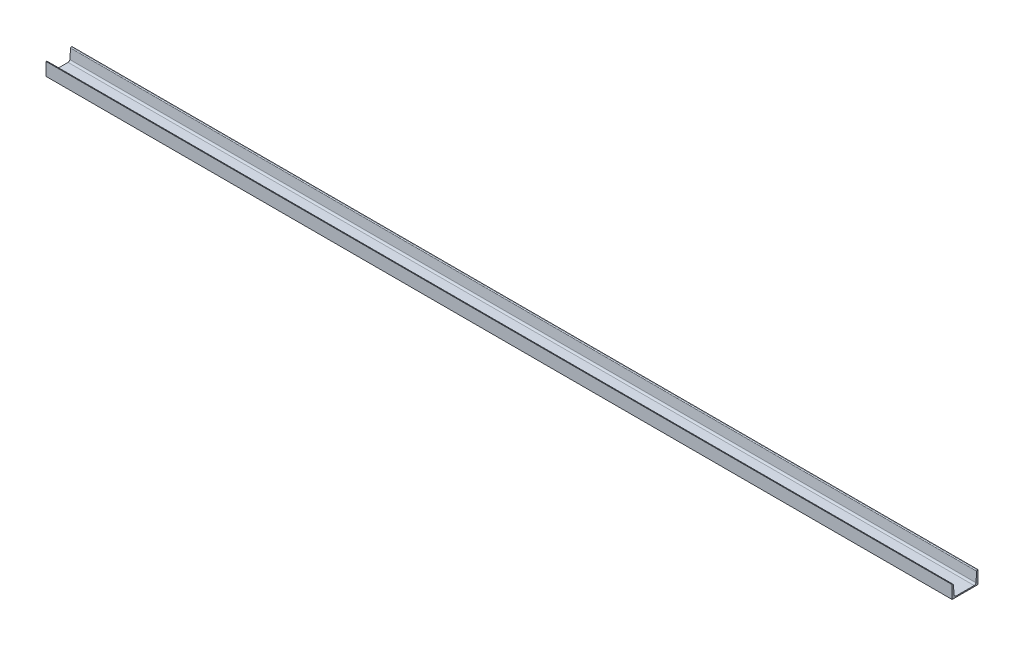
ISO-10303-21;
HEADER;
FILE_DESCRIPTION(('STEP AP214'),'2;1');
FILE_NAME('part.step','',(''),(''),'','','');
FILE_SCHEMA(('AUTOMOTIVE_DESIGN { 1 0 10303 214 1 1 1 1 }'));
ENDSEC;
DATA;
#1=APPLICATION_CONTEXT('core data for automotive mechanical design processes');
#2=APPLICATION_PROTOCOL_DEFINITION('international standard','automotive_design',2000,#1);
#3=PRODUCT_CONTEXT('',#1,'mechanical');
#4=PRODUCT('Part','Part','',(#3));
#5=PRODUCT_RELATED_PRODUCT_CATEGORY('part','',(#4));
#6=PRODUCT_DEFINITION_FORMATION('','',#4);
#7=PRODUCT_DEFINITION_CONTEXT('part definition',#1,'design');
#8=PRODUCT_DEFINITION('design','',#6,#7);
#9=PRODUCT_DEFINITION_SHAPE('','',#8);
#10=(LENGTH_UNIT() NAMED_UNIT(*) SI_UNIT(.MILLI.,.METRE.));
#11=(NAMED_UNIT(*) PLANE_ANGLE_UNIT() SI_UNIT($,.RADIAN.));
#12=(NAMED_UNIT(*) SI_UNIT($,.STERADIAN.) SOLID_ANGLE_UNIT());
#13=UNCERTAINTY_MEASURE_WITH_UNIT(LENGTH_MEASURE(1.E-05),#10,'distance_accuracy_value','');
#14=(GEOMETRIC_REPRESENTATION_CONTEXT(3) GLOBAL_UNCERTAINTY_ASSIGNED_CONTEXT((#13)) GLOBAL_UNIT_ASSIGNED_CONTEXT((#10,
#11,#12)) REPRESENTATION_CONTEXT('',''));
#15=CARTESIAN_POINT('',(0.,0.,0.));
#16=DIRECTION('',(0.,0.,1.));
#17=DIRECTION('',(1.,0.,0.));
#18=AXIS2_PLACEMENT_3D('',#15,#16,#17);
#19=CARTESIAN_POINT('',(5250.,70.,147.57814259585));
#20=DIRECTION('',(-1.,0.,0.));
#21=DIRECTION('',(0.,0.,1.));
#22=AXIS2_PLACEMENT_3D('',#19,#20,#21);
#23=CYLINDRICAL_SURFACE('',#22,5.00000000000001);
#24=CARTESIAN_POINT('',(0.,70.,147.57814259585));
#25=DIRECTION('',(1.,0.,0.));
#26=DIRECTION('',(0.,0.,-1.));
#27=AXIS2_PLACEMENT_3D('',#24,#25,#26);
#28=CIRCLE('',#27,5.00000000000001);
#29=CARTESIAN_POINT('',(0.,70.4357787137382,142.597169105391));
#30=VERTEX_POINT('',#29);
#31=CARTESIAN_POINT('',(0.,75.,147.57814259585));
#32=VERTEX_POINT('',#31);
#33=EDGE_CURVE('E198',#30,#32,#28,.T.);
#34=ORIENTED_EDGE('',*,*,#33,.T.);
#35=DIRECTION('',(-1.,0.,0.));
#36=VECTOR('',#35,1.);
#37=CARTESIAN_POINT('',(5250.,75.,147.57814259585));
#38=LINE('',#37,#36);
#39=CARTESIAN_POINT('',(5250.,75.,147.57814259585));
#40=VERTEX_POINT('',#39);
#41=EDGE_CURVE('E13',#40,#32,#38,.T.);
#42=ORIENTED_EDGE('',*,*,#41,.F.);
#43=CARTESIAN_POINT('',(5250.,70.,147.57814259585));
#44=DIRECTION('',(1.,0.,0.));
#45=DIRECTION('',(0.,0.,-1.));
#46=AXIS2_PLACEMENT_3D('',#43,#44,#45);
#47=CIRCLE('',#46,5.00000000000001);
#48=CARTESIAN_POINT('',(5250.,70.4357787137382,142.597169105391));
#49=VERTEX_POINT('',#48);
#50=EDGE_CURVE('E225',#49,#40,#47,.T.);
#51=ORIENTED_EDGE('',*,*,#50,.F.);
#52=DIRECTION('',(-1.,0.,0.));
#53=VECTOR('',#52,1.);
#54=CARTESIAN_POINT('',(5250.,70.4357787137382,142.597169105391));
#55=LINE('',#54,#53);
#56=EDGE_CURVE('E197',#49,#30,#55,.T.);
#57=ORIENTED_EDGE('',*,*,#56,.T.);
#58=EDGE_LOOP('',(#34,#42,#51,#57));
#59=FACE_BOUND('',#58,.T.);
#60=ADVANCED_FACE('F79',(#59),#23,.T.);
#61=CARTESIAN_POINT('',(5250.,75.,150.));
#62=DIRECTION('',(0.,-1.,0.));
#63=DIRECTION('',(0.,0.,-1.));
#64=AXIS2_PLACEMENT_3D('',#61,#62,#63);
#65=PLANE('',#64);
#66=DIRECTION('',(0.,0.,1.));
#67=VECTOR('',#66,1.);
#68=CARTESIAN_POINT('',(0.,75.,150.));
#69=LINE('',#68,#67);
#70=CARTESIAN_POINT('',(0.,75.,150.));
#71=VERTEX_POINT('',#70);
#72=EDGE_CURVE('E201',#32,#71,#69,.T.);
#73=ORIENTED_EDGE('',*,*,#72,.T.);
#74=DIRECTION('',(-1.,0.,0.));
#75=VECTOR('',#74,1.);
#76=CARTESIAN_POINT('',(5250.,75.,150.));
#77=LINE('',#76,#75);
#78=CARTESIAN_POINT('',(5250.,75.,150.));
#79=VERTEX_POINT('',#78);
#80=EDGE_CURVE('E88',#79,#71,#77,.T.);
#81=ORIENTED_EDGE('',*,*,#80,.F.);
#82=DIRECTION('',(0.,0.,1.));
#83=VECTOR('',#82,1.);
#84=CARTESIAN_POINT('',(5250.,75.,150.));
#85=LINE('',#84,#83);
#86=EDGE_CURVE('E152',#40,#79,#85,.T.);
#87=ORIENTED_EDGE('',*,*,#86,.F.);
#88=ORIENTED_EDGE('',*,*,#41,.T.);
#89=EDGE_LOOP('',(#73,#81,#87,#88));
#90=FACE_BOUND('',#89,.T.);
#91=ADVANCED_FACE('F298',(#90),#65,.F.);
#92=CARTESIAN_POINT('',(5250.,75.,150.));
#93=DIRECTION('',(0.,0.,-1.));
#94=DIRECTION('',(-1.,0.,0.));
#95=AXIS2_PLACEMENT_3D('',#92,#93,#94);
#96=PLANE('',#95);
#97=DIRECTION('',(0.,-1.,0.));
#98=VECTOR('',#97,1.);
#99=CARTESIAN_POINT('',(0.,75.,150.));
#100=LINE('',#99,#98);
#101=CARTESIAN_POINT('',(0.,0.,150.));
#102=VERTEX_POINT('',#101);
#103=EDGE_CURVE('E203',#71,#102,#100,.T.);
#104=ORIENTED_EDGE('',*,*,#103,.T.);
#105=DIRECTION('',(-1.,0.,0.));
#106=VECTOR('',#105,1.);
#107=CARTESIAN_POINT('',(5250.,0.,150.));
#108=LINE('',#107,#106);
#109=CARTESIAN_POINT('',(5250.,0.,150.));
#110=VERTEX_POINT('',#109);
#111=EDGE_CURVE('E242',#110,#102,#108,.T.);
#112=ORIENTED_EDGE('',*,*,#111,.F.);
#113=DIRECTION('',(0.,-1.,0.));
#114=VECTOR('',#113,1.);
#115=CARTESIAN_POINT('',(5250.,75.,150.));
#116=LINE('',#115,#114);
#117=EDGE_CURVE('E249',#79,#110,#116,.T.);
#118=ORIENTED_EDGE('',*,*,#117,.F.);
#119=ORIENTED_EDGE('',*,*,#80,.T.);
#120=EDGE_LOOP('',(#104,#112,#118,#119));
#121=FACE_BOUND('',#120,.T.);
#122=ADVANCED_FACE('F250',(#121),#96,.F.);
#123=CARTESIAN_POINT('',(5250.,0.,150.));
#124=DIRECTION('',(0.,1.,0.));
#125=DIRECTION('',(0.,0.,1.));
#126=AXIS2_PLACEMENT_3D('',#123,#124,#125);
#127=PLANE('',#126);
#128=DIRECTION('',(0.,0.,-1.));
#129=VECTOR('',#128,1.);
#130=CARTESIAN_POINT('',(0.,0.,150.));
#131=LINE('',#130,#129);
#132=CARTESIAN_POINT('',(0.,0.,0.));
#133=VERTEX_POINT('',#132);
#134=EDGE_CURVE('E209',#102,#133,#131,.T.);
#135=ORIENTED_EDGE('',*,*,#134,.T.);
#136=DIRECTION('',(-1.,0.,0.));
#137=VECTOR('',#136,1.);
#138=CARTESIAN_POINT('',(5250.,0.,0.));
#139=LINE('',#138,#137);
#140=CARTESIAN_POINT('',(5250.,0.,0.));
#141=VERTEX_POINT('',#140);
#142=EDGE_CURVE('E239',#141,#133,#139,.T.);
#143=ORIENTED_EDGE('',*,*,#142,.F.);
#144=DIRECTION('',(0.,0.,-1.));
#145=VECTOR('',#144,1.);
#146=CARTESIAN_POINT('',(5250.,0.,150.));
#147=LINE('',#146,#145);
#148=EDGE_CURVE('E270',#110,#141,#147,.T.);
#149=ORIENTED_EDGE('',*,*,#148,.F.);
#150=ORIENTED_EDGE('',*,*,#111,.T.);
#151=EDGE_LOOP('',(#135,#143,#149,#150));
#152=FACE_BOUND('',#151,.T.);
#153=ADVANCED_FACE('F256',(#152),#127,.F.);
#154=CARTESIAN_POINT('',(5250.,75.,0.));
#155=DIRECTION('',(0.,0.,1.));
#156=DIRECTION('',(0.,-1.,0.));
#157=AXIS2_PLACEMENT_3D('',#154,#155,#156);
#158=PLANE('',#157);
#159=DIRECTION('',(0.,1.,0.));
#160=VECTOR('',#159,1.);
#161=CARTESIAN_POINT('',(0.,75.,0.));
#162=LINE('',#161,#160);
#163=CARTESIAN_POINT('',(0.,75.,0.));
#164=VERTEX_POINT('',#163);
#165=EDGE_CURVE('E206',#133,#164,#162,.T.);
#166=ORIENTED_EDGE('',*,*,#165,.T.);
#167=DIRECTION('',(-1.,0.,0.));
#168=VECTOR('',#167,1.);
#169=CARTESIAN_POINT('',(5250.,75.,0.));
#170=LINE('',#169,#168);
#171=CARTESIAN_POINT('',(5250.,75.,0.));
#172=VERTEX_POINT('',#171);
#173=EDGE_CURVE('E234',#172,#164,#170,.T.);
#174=ORIENTED_EDGE('',*,*,#173,.F.);
#175=DIRECTION('',(0.,1.,0.));
#176=VECTOR('',#175,1.);
#177=CARTESIAN_POINT('',(5250.,75.,0.));
#178=LINE('',#177,#176);
#179=EDGE_CURVE('E264',#141,#172,#178,.T.);
#180=ORIENTED_EDGE('',*,*,#179,.F.);
#181=ORIENTED_EDGE('',*,*,#142,.T.);
#182=EDGE_LOOP('',(#166,#174,#180,#181));
#183=FACE_BOUND('',#182,.T.);
#184=ADVANCED_FACE('F265',(#183),#158,.F.);
#185=CARTESIAN_POINT('',(5250.,75.,0.));
#186=DIRECTION('',(0.,-1.,0.));
#187=DIRECTION('',(0.,0.,-1.));
#188=AXIS2_PLACEMENT_3D('',#185,#186,#187);
#189=PLANE('',#188);
#190=DIRECTION('',(0.,0.,1.));
#191=VECTOR('',#190,1.);
#192=CARTESIAN_POINT('',(0.,75.,0.));
#193=LINE('',#192,#191);
#194=CARTESIAN_POINT('',(0.,75.,2.42185740415011));
#195=VERTEX_POINT('',#194);
#196=EDGE_CURVE('E213',#164,#195,#193,.T.);
#197=ORIENTED_EDGE('',*,*,#196,.T.);
#198=DIRECTION('',(-1.,0.,0.));
#199=VECTOR('',#198,1.);
#200=CARTESIAN_POINT('',(5250.,75.,2.42185740415011));
#201=LINE('',#200,#199);
#202=CARTESIAN_POINT('',(5250.,75.,2.42185740415011));
#203=VERTEX_POINT('',#202);
#204=EDGE_CURVE('E235',#203,#195,#201,.T.);
#205=ORIENTED_EDGE('',*,*,#204,.F.);
#206=DIRECTION('',(0.,0.,1.));
#207=VECTOR('',#206,1.);
#208=CARTESIAN_POINT('',(5250.,75.,0.));
#209=LINE('',#208,#207);
#210=EDGE_CURVE('E266',#172,#203,#209,.T.);
#211=ORIENTED_EDGE('',*,*,#210,.F.);
#212=ORIENTED_EDGE('',*,*,#173,.T.);
#213=EDGE_LOOP('',(#197,#205,#211,#212));
#214=FACE_BOUND('',#213,.T.);
#215=ADVANCED_FACE('F313',(#214),#189,.F.);
#216=CARTESIAN_POINT('',(5250.,70.,2.42185740415011));
#217=DIRECTION('',(-1.,0.,0.));
#218=DIRECTION('',(0.,0.,1.));
#219=AXIS2_PLACEMENT_3D('',#216,#217,#218);
#220=CYLINDRICAL_SURFACE('',#219,4.99999999999999);
#221=CARTESIAN_POINT('',(0.,70.,2.42185740415011));
#222=DIRECTION('',(1.,0.,0.));
#223=DIRECTION('',(0.,0.,1.));
#224=AXIS2_PLACEMENT_3D('',#221,#222,#223);
#225=CIRCLE('',#224,4.99999999999999);
#226=CARTESIAN_POINT('',(0.,70.4357787137383,7.40283089460884));
#227=VERTEX_POINT('',#226);
#228=EDGE_CURVE('E211',#195,#227,#225,.T.);
#229=ORIENTED_EDGE('',*,*,#228,.T.);
#230=DIRECTION('',(-1.,0.,0.));
#231=VECTOR('',#230,1.);
#232=CARTESIAN_POINT('',(5250.,70.4357787137383,7.40283089460884));
#233=LINE('',#232,#231);
#234=CARTESIAN_POINT('',(5250.,70.4357787137383,7.40283089460884));
#235=VERTEX_POINT('',#234);
#236=EDGE_CURVE('E227',#235,#227,#233,.T.);
#237=ORIENTED_EDGE('',*,*,#236,.F.);
#238=CARTESIAN_POINT('',(5250.,70.,2.42185740415011));
#239=DIRECTION('',(1.,0.,0.));
#240=DIRECTION('',(0.,0.,1.));
#241=AXIS2_PLACEMENT_3D('',#238,#239,#240);
#242=CIRCLE('',#241,4.99999999999999);
#243=EDGE_CURVE('E267',#203,#235,#242,.T.);
#244=ORIENTED_EDGE('',*,*,#243,.F.);
#245=ORIENTED_EDGE('',*,*,#204,.T.);
#246=EDGE_LOOP('',(#229,#237,#244,#245));
#247=FACE_BOUND('',#246,.T.);
#248=ADVANCED_FACE('F316',(#247),#220,.T.);
#249=CARTESIAN_POINT('',(5250.,15.6284425725235,12.1978514850195));
#250=DIRECTION('',(0.,-0.087155742747653,-0.996194698091746));
#251=DIRECTION('',(0.,0.996194698091746,-0.087155742747653));
#252=AXIS2_PLACEMENT_3D('',#249,#250,#251);
#253=PLANE('',#252);
#254=DIRECTION('',(0.,-0.996194698091746,0.087155742747653));
#255=VECTOR('',#254,1.);
#256=CARTESIAN_POINT('',(0.,15.6284425725235,12.1978514850195));
#257=LINE('',#256,#255);
#258=CARTESIAN_POINT('',(0.,15.6284425725235,12.1978514850195));
#259=VERTEX_POINT('',#258);
#260=EDGE_CURVE('E214',#227,#259,#257,.T.);
#261=ORIENTED_EDGE('',*,*,#260,.T.);
#262=DIRECTION('',(-1.,0.,0.));
#263=VECTOR('',#262,1.);
#264=CARTESIAN_POINT('',(5250.,15.6284425725235,12.1978514850195));
#265=LINE('',#264,#263);
#266=CARTESIAN_POINT('',(5250.,15.6284425725235,12.1978514850195));
#267=VERTEX_POINT('',#266);
#268=EDGE_CURVE('E226',#267,#259,#265,.T.);
#269=ORIENTED_EDGE('',*,*,#268,.F.);
#270=DIRECTION('',(0.,-0.996194698091746,0.087155742747653));
#271=VECTOR('',#270,1.);
#272=CARTESIAN_POINT('',(5250.,15.6284425725235,12.1978514850195));
#273=LINE('',#272,#271);
#274=EDGE_CURVE('E274',#235,#267,#273,.T.);
#275=ORIENTED_EDGE('',*,*,#274,.F.);
#276=ORIENTED_EDGE('',*,*,#236,.T.);
#277=EDGE_LOOP('',(#261,#269,#275,#276));
#278=FACE_BOUND('',#277,.T.);
#279=ADVANCED_FACE('F282',(#278),#253,.F.);
#280=CARTESIAN_POINT('',(5250.,16.5,22.159798465937));
#281=DIRECTION('',(-1.,0.,0.));
#282=DIRECTION('',(0.,0.,1.));
#283=AXIS2_PLACEMENT_3D('',#280,#281,#282);
#284=CYLINDRICAL_SURFACE('',#283,10.);
#285=CARTESIAN_POINT('',(0.,16.5,22.159798465937));
#286=DIRECTION('',(-1.,0.,0.));
#287=DIRECTION('',(0.,0.,-1.));
#288=AXIS2_PLACEMENT_3D('',#285,#286,#287);
#289=CIRCLE('',#288,10.);
#290=CARTESIAN_POINT('',(0.,6.50000000000005,22.159798465937));
#291=VERTEX_POINT('',#290);
#292=EDGE_CURVE('E220',#259,#291,#289,.T.);
#293=ORIENTED_EDGE('',*,*,#292,.T.);
#294=DIRECTION('',(-1.,0.,0.));
#295=VECTOR('',#294,1.);
#296=CARTESIAN_POINT('',(5250.,6.50000000000005,22.159798465937));
#297=LINE('',#296,#295);
#298=CARTESIAN_POINT('',(5250.,6.50000000000005,22.159798465937));
#299=VERTEX_POINT('',#298);
#300=EDGE_CURVE('E192',#299,#291,#297,.T.);
#301=ORIENTED_EDGE('',*,*,#300,.F.);
#302=CARTESIAN_POINT('',(5250.,16.5,22.159798465937));
#303=DIRECTION('',(-1.,0.,0.));
#304=DIRECTION('',(0.,0.,-1.));
#305=AXIS2_PLACEMENT_3D('',#302,#303,#304);
#306=CIRCLE('',#305,10.);
#307=EDGE_CURVE('E185',#267,#299,#306,.T.);
#308=ORIENTED_EDGE('',*,*,#307,.F.);
#309=ORIENTED_EDGE('',*,*,#268,.T.);
#310=EDGE_LOOP('',(#293,#301,#308,#309));
#311=FACE_BOUND('',#310,.T.);
#312=ADVANCED_FACE('F283',(#311),#284,.F.);
#313=CARTESIAN_POINT('',(5250.,6.50000000000002,127.840201534063));
#314=DIRECTION('',(0.,-1.,0.));
#315=DIRECTION('',(0.,0.,-1.));
#316=AXIS2_PLACEMENT_3D('',#313,#314,#315);
#317=PLANE('',#316);
#318=DIRECTION('',(0.,0.,1.));
#319=VECTOR('',#318,1.);
#320=CARTESIAN_POINT('',(0.,6.50000000000002,127.840201534063));
#321=LINE('',#320,#319);
#322=CARTESIAN_POINT('',(0.,6.50000000000001,127.840201534063));
#323=VERTEX_POINT('',#322);
#324=EDGE_CURVE('E189',#291,#323,#321,.T.);
#325=ORIENTED_EDGE('',*,*,#324,.T.);
#326=DIRECTION('',(-1.,0.,0.));
#327=VECTOR('',#326,1.);
#328=CARTESIAN_POINT('',(5250.,6.50000000000001,127.840201534063));
#329=LINE('',#328,#327);
#330=CARTESIAN_POINT('',(5250.,6.50000000000001,127.840201534063));
#331=VERTEX_POINT('',#330);
#332=EDGE_CURVE('E190',#331,#323,#329,.T.);
#333=ORIENTED_EDGE('',*,*,#332,.F.);
#334=DIRECTION('',(0.,0.,1.));
#335=VECTOR('',#334,1.);
#336=CARTESIAN_POINT('',(5250.,6.50000000000002,127.840201534063));
#337=LINE('',#336,#335);
#338=EDGE_CURVE('E176',#299,#331,#337,.T.);
#339=ORIENTED_EDGE('',*,*,#338,.F.);
#340=ORIENTED_EDGE('',*,*,#300,.T.);
#341=EDGE_LOOP('',(#325,#333,#339,#340));
#342=FACE_BOUND('',#341,.T.);
#343=ADVANCED_FACE('F187',(#342),#317,.F.);
#344=CARTESIAN_POINT('',(5250.,16.5,127.840201534063));
#345=DIRECTION('',(-1.,0.,0.));
#346=DIRECTION('',(0.,0.,1.));
#347=AXIS2_PLACEMENT_3D('',#344,#345,#346);
#348=CYLINDRICAL_SURFACE('',#347,9.99999999999999);
#349=CARTESIAN_POINT('',(0.,16.5,127.840201534063));
#350=DIRECTION('',(-1.,0.,0.));
#351=DIRECTION('',(0.,0.,1.));
#352=AXIS2_PLACEMENT_3D('',#349,#350,#351);
#353=CIRCLE('',#352,9.99999999999999);
#354=CARTESIAN_POINT('',(0.,15.6284425725235,137.802148514981));
#355=VERTEX_POINT('',#354);
#356=EDGE_CURVE('E140',#323,#355,#353,.T.);
#357=ORIENTED_EDGE('',*,*,#356,.T.);
#358=DIRECTION('',(-1.,0.,0.));
#359=VECTOR('',#358,1.);
#360=CARTESIAN_POINT('',(5250.,15.6284425725235,137.802148514981));
#361=LINE('',#360,#359);
#362=CARTESIAN_POINT('',(5250.,15.6284425725235,137.802148514981));
#363=VERTEX_POINT('',#362);
#364=EDGE_CURVE('E195',#363,#355,#361,.T.);
#365=ORIENTED_EDGE('',*,*,#364,.F.);
#366=CARTESIAN_POINT('',(5250.,16.5,127.840201534063));
#367=DIRECTION('',(-1.,0.,0.));
#368=DIRECTION('',(0.,0.,1.));
#369=AXIS2_PLACEMENT_3D('',#366,#367,#368);
#370=CIRCLE('',#369,9.99999999999999);
#371=EDGE_CURVE('E179',#331,#363,#370,.T.);
#372=ORIENTED_EDGE('',*,*,#371,.F.);
#373=ORIENTED_EDGE('',*,*,#332,.T.);
#374=EDGE_LOOP('',(#357,#365,#372,#373));
#375=FACE_BOUND('',#374,.T.);
#376=ADVANCED_FACE('F191',(#375),#348,.F.);
#377=CARTESIAN_POINT('',(5250.,15.6284425725235,137.802148514981));
#378=DIRECTION('',(0.,-0.0871557427476512,0.996194698091746));
#379=DIRECTION('',(0.,-0.996194698091746,-0.0871557427476512));
#380=AXIS2_PLACEMENT_3D('',#377,#378,#379);
#381=PLANE('',#380);
#382=DIRECTION('',(0.,0.996194698091746,0.0871557427476512));
#383=VECTOR('',#382,1.);
#384=CARTESIAN_POINT('',(0.,15.6284425725235,137.802148514981));
#385=LINE('',#384,#383);
#386=EDGE_CURVE('E142',#355,#30,#385,.T.);
#387=ORIENTED_EDGE('',*,*,#386,.T.);
#388=ORIENTED_EDGE('',*,*,#56,.F.);
#389=DIRECTION('',(0.,0.996194698091746,0.0871557427476512));
#390=VECTOR('',#389,1.);
#391=CARTESIAN_POINT('',(5250.,15.6284425725235,137.802148514981));
#392=LINE('',#391,#390);
#393=EDGE_CURVE('E96',#363,#49,#392,.T.);
#394=ORIENTED_EDGE('',*,*,#393,.F.);
#395=ORIENTED_EDGE('',*,*,#364,.T.);
#396=EDGE_LOOP('',(#387,#388,#394,#395));
#397=FACE_BOUND('',#396,.T.);
#398=ADVANCED_FACE('F286',(#397),#381,.F.);
#399=CARTESIAN_POINT('',(5250.,70.,147.57814259585));
#400=DIRECTION('',(1.,0.,0.));
#401=DIRECTION('',(0.,0.,-1.));
#402=AXIS2_PLACEMENT_3D('',#399,#400,#401);
#403=PLANE('',#402);
#404=ORIENTED_EDGE('',*,*,#50,.T.);
#405=ORIENTED_EDGE('',*,*,#86,.T.);
#406=ORIENTED_EDGE('',*,*,#117,.T.);
#407=ORIENTED_EDGE('',*,*,#148,.T.);
#408=ORIENTED_EDGE('',*,*,#179,.T.);
#409=ORIENTED_EDGE('',*,*,#210,.T.);
#410=ORIENTED_EDGE('',*,*,#243,.T.);
#411=ORIENTED_EDGE('',*,*,#274,.T.);
#412=ORIENTED_EDGE('',*,*,#307,.T.);
#413=ORIENTED_EDGE('',*,*,#338,.T.);
#414=ORIENTED_EDGE('',*,*,#371,.T.);
#415=ORIENTED_EDGE('',*,*,#393,.T.);
#416=EDGE_LOOP('',(#404,#405,#406,#407,#408,#409,#410,#411,#412,#413,#414,#415));
#417=FACE_BOUND('',#416,.T.);
#418=ADVANCED_FACE('F178',(#417),#403,.T.);
#419=CARTESIAN_POINT('',(0.,70.,147.57814259585));
#420=DIRECTION('',(1.,0.,0.));
#421=DIRECTION('',(0.,0.,-1.));
#422=AXIS2_PLACEMENT_3D('',#419,#420,#421);
#423=PLANE('',#422);
#424=ORIENTED_EDGE('',*,*,#33,.F.);
#425=ORIENTED_EDGE('',*,*,#386,.F.);
#426=ORIENTED_EDGE('',*,*,#356,.F.);
#427=ORIENTED_EDGE('',*,*,#324,.F.);
#428=ORIENTED_EDGE('',*,*,#292,.F.);
#429=ORIENTED_EDGE('',*,*,#260,.F.);
#430=ORIENTED_EDGE('',*,*,#228,.F.);
#431=ORIENTED_EDGE('',*,*,#196,.F.);
#432=ORIENTED_EDGE('',*,*,#165,.F.);
#433=ORIENTED_EDGE('',*,*,#134,.F.);
#434=ORIENTED_EDGE('',*,*,#103,.F.);
#435=ORIENTED_EDGE('',*,*,#72,.F.);
#436=EDGE_LOOP('',(#424,#425,#426,#427,#428,#429,#430,#431,#432,#433,#434,#435));
#437=FACE_BOUND('',#436,.T.);
#438=ADVANCED_FACE('F255',(#437),#423,.F.);
#439=CLOSED_SHELL('',(#60,#91,#122,#153,#184,#215,#248,#279,#312,#343,#376,#398,#418,#438));
#440=MANIFOLD_SOLID_BREP('B2',#439);
#441=ADVANCED_BREP_SHAPE_REPRESENTATION('',(#18,#440),#14);
#442=SHAPE_DEFINITION_REPRESENTATION(#9,#441);
ENDSEC;
END-ISO-10303-21;
